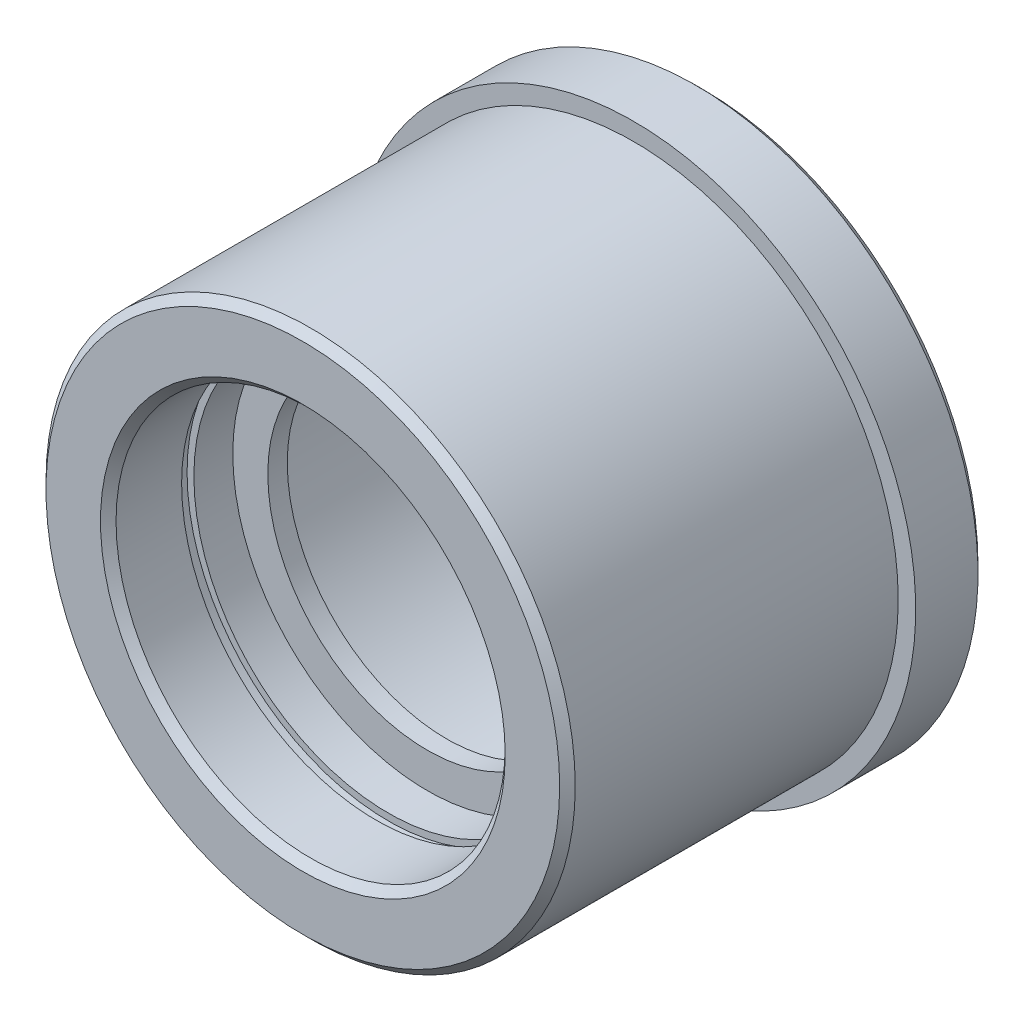
ISO-10303-21;
HEADER;
FILE_DESCRIPTION(('STEP AP214'),'2;1');
FILE_NAME('part.step','',(''),(''),'','','');
FILE_SCHEMA(('AUTOMOTIVE_DESIGN { 1 0 10303 214 1 1 1 1 }'));
ENDSEC;
DATA;
#1=APPLICATION_CONTEXT('core data for automotive mechanical design processes');
#2=APPLICATION_PROTOCOL_DEFINITION('international standard','automotive_design',2000,#1);
#3=PRODUCT_CONTEXT('',#1,'mechanical');
#4=PRODUCT('Part','Part','',(#3));
#5=PRODUCT_RELATED_PRODUCT_CATEGORY('part','',(#4));
#6=PRODUCT_DEFINITION_FORMATION('','',#4);
#7=PRODUCT_DEFINITION_CONTEXT('part definition',#1,'design');
#8=PRODUCT_DEFINITION('design','',#6,#7);
#9=PRODUCT_DEFINITION_SHAPE('','',#8);
#10=(LENGTH_UNIT() NAMED_UNIT(*) SI_UNIT(.MILLI.,.METRE.));
#11=(NAMED_UNIT(*) PLANE_ANGLE_UNIT() SI_UNIT($,.RADIAN.));
#12=(NAMED_UNIT(*) SI_UNIT($,.STERADIAN.) SOLID_ANGLE_UNIT());
#13=UNCERTAINTY_MEASURE_WITH_UNIT(LENGTH_MEASURE(1.E-05),#10,'distance_accuracy_value','');
#14=(GEOMETRIC_REPRESENTATION_CONTEXT(3) GLOBAL_UNCERTAINTY_ASSIGNED_CONTEXT((#13)) GLOBAL_UNIT_ASSIGNED_CONTEXT((#10,
#11,#12)) REPRESENTATION_CONTEXT('',''));
#15=CARTESIAN_POINT('',(0.,0.,0.));
#16=DIRECTION('',(0.,0.,1.));
#17=DIRECTION('',(1.,0.,0.));
#18=AXIS2_PLACEMENT_3D('',#15,#16,#17);
#19=CARTESIAN_POINT('',(0.,50.,103.));
#20=DIRECTION('',(0.,0.,1.));
#21=DIRECTION('',(1.,0.,0.));
#22=AXIS2_PLACEMENT_3D('',#19,#20,#21);
#23=PLANE('',#22);
#24=CARTESIAN_POINT('',(0.,0.,103.));
#25=DIRECTION('',(0.,0.,1.));
#26=DIRECTION('',(1.,0.,0.));
#27=AXIS2_PLACEMENT_3D('',#24,#25,#26);
#28=CIRCLE('',#27,66.);
#29=CARTESIAN_POINT('',(66.,0.,103.));
#30=VERTEX_POINT('',#29);
#31=EDGE_CURVE('E67',#30,#30,#28,.T.);
#32=ORIENTED_EDGE('',*,*,#31,.T.);
#33=EDGE_LOOP('',(#32));
#34=FACE_BOUND('',#33,.T.);
#35=CARTESIAN_POINT('',(0.,0.,103.));
#36=DIRECTION('',(0.,0.,1.));
#37=DIRECTION('',(1.,0.,0.));
#38=AXIS2_PLACEMENT_3D('',#35,#36,#37);
#39=CIRCLE('',#38,52.);
#40=CARTESIAN_POINT('',(52.,0.,103.));
#41=VERTEX_POINT('',#40);
#42=EDGE_CURVE('E70',#41,#41,#39,.F.);
#43=ORIENTED_EDGE('',*,*,#42,.T.);
#44=EDGE_LOOP('',(#43));
#45=FACE_BOUND('',#44,.T.);
#46=ADVANCED_FACE('F43',(#34,#45),#23,.T.);
#47=CARTESIAN_POINT('',(0.,0.,0.));
#48=DIRECTION('',(0.,0.,-1.));
#49=DIRECTION('',(-1.,0.,0.));
#50=AXIS2_PLACEMENT_3D('',#47,#48,#49);
#51=CYLINDRICAL_SURFACE('',#50,68.);
#52=CARTESIAN_POINT('',(0.,0.,101.));
#53=DIRECTION('',(0.,0.,1.));
#54=DIRECTION('',(1.,0.,0.));
#55=AXIS2_PLACEMENT_3D('',#52,#53,#54);
#56=CIRCLE('',#55,68.);
#57=CARTESIAN_POINT('',(68.,0.,101.));
#58=VERTEX_POINT('',#57);
#59=EDGE_CURVE('E73',#58,#58,#56,.F.);
#60=ORIENTED_EDGE('',*,*,#59,.T.);
#61=EDGE_LOOP('',(#60));
#62=FACE_BOUND('',#61,.T.);
#63=CARTESIAN_POINT('',(0.,0.,18.));
#64=DIRECTION('',(0.,0.,-1.));
#65=DIRECTION('',(-1.,0.,0.));
#66=AXIS2_PLACEMENT_3D('',#63,#64,#65);
#67=CIRCLE('',#66,68.);
#68=CARTESIAN_POINT('',(-68.,0.,18.));
#69=VERTEX_POINT('',#68);
#70=EDGE_CURVE('E76',#69,#69,#67,.T.);
#71=ORIENTED_EDGE('',*,*,#70,.F.);
#72=EDGE_LOOP('',(#71));
#73=FACE_BOUND('',#72,.T.);
#74=ADVANCED_FACE('F143',(#62,#73),#51,.T.);
#75=CARTESIAN_POINT('',(0.,72.5,18.));
#76=DIRECTION('',(0.,0.,1.));
#77=DIRECTION('',(1.,0.,0.));
#78=AXIS2_PLACEMENT_3D('',#75,#76,#77);
#79=PLANE('',#78);
#80=ORIENTED_EDGE('',*,*,#70,.T.);
#81=EDGE_LOOP('',(#80));
#82=FACE_BOUND('',#81,.T.);
#83=CARTESIAN_POINT('',(0.,0.,18.));
#84=DIRECTION('',(0.,0.,-1.));
#85=DIRECTION('',(-1.,0.,0.));
#86=AXIS2_PLACEMENT_3D('',#83,#84,#85);
#87=CIRCLE('',#86,72.5);
#88=CARTESIAN_POINT('',(-72.5,0.,18.));
#89=VERTEX_POINT('',#88);
#90=EDGE_CURVE('E79',#89,#89,#87,.T.);
#91=ORIENTED_EDGE('',*,*,#90,.F.);
#92=EDGE_LOOP('',(#91));
#93=FACE_BOUND('',#92,.T.);
#94=ADVANCED_FACE('F149',(#82,#93),#79,.T.);
#95=CARTESIAN_POINT('',(0.,0.,0.));
#96=DIRECTION('',(0.,0.,-1.));
#97=DIRECTION('',(-1.,0.,0.));
#98=AXIS2_PLACEMENT_3D('',#95,#96,#97);
#99=CYLINDRICAL_SURFACE('',#98,72.5);
#100=CARTESIAN_POINT('',(0.,0.,2.00000000000001));
#101=DIRECTION('',(0.,0.,-1.));
#102=DIRECTION('',(-1.,0.,0.));
#103=AXIS2_PLACEMENT_3D('',#100,#101,#102);
#104=CIRCLE('',#103,72.5);
#105=CARTESIAN_POINT('',(-72.5,0.,2.00000000000001));
#106=VERTEX_POINT('',#105);
#107=EDGE_CURVE('E51',#106,#106,#104,.F.);
#108=ORIENTED_EDGE('',*,*,#107,.T.);
#109=EDGE_LOOP('',(#108));
#110=FACE_BOUND('',#109,.T.);
#111=ORIENTED_EDGE('',*,*,#90,.T.);
#112=EDGE_LOOP('',(#111));
#113=FACE_BOUND('',#112,.T.);
#114=ADVANCED_FACE('F184',(#110,#113),#99,.T.);
#115=CARTESIAN_POINT('',(0.,72.5,0.));
#116=DIRECTION('',(0.,0.,-1.));
#117=DIRECTION('',(-1.,0.,0.));
#118=AXIS2_PLACEMENT_3D('',#115,#116,#117);
#119=PLANE('',#118);
#120=CARTESIAN_POINT('',(0.,0.,0.));
#121=DIRECTION('',(0.,0.,-1.));
#122=DIRECTION('',(-1.,0.,0.));
#123=AXIS2_PLACEMENT_3D('',#120,#121,#122);
#124=CIRCLE('',#123,70.5);
#125=CARTESIAN_POINT('',(-70.5,0.,0.));
#126=VERTEX_POINT('',#125);
#127=EDGE_CURVE('E55',#126,#126,#124,.T.);
#128=ORIENTED_EDGE('',*,*,#127,.T.);
#129=EDGE_LOOP('',(#128));
#130=FACE_BOUND('',#129,.T.);
#131=CARTESIAN_POINT('',(0.,0.,0.));
#132=DIRECTION('',(0.,0.,-1.));
#133=DIRECTION('',(-1.,0.,0.));
#134=AXIS2_PLACEMENT_3D('',#131,#132,#133);
#135=CIRCLE('',#134,62.);
#136=CARTESIAN_POINT('',(-62.,0.,0.));
#137=VERTEX_POINT('',#136);
#138=EDGE_CURVE('E59',#137,#137,#135,.F.);
#139=ORIENTED_EDGE('',*,*,#138,.T.);
#140=EDGE_LOOP('',(#139));
#141=FACE_BOUND('',#140,.T.);
#142=ADVANCED_FACE('F180',(#130,#141),#119,.T.);
#143=CARTESIAN_POINT('',(0.,0.,0.));
#144=DIRECTION('',(0.,0.,-1.));
#145=DIRECTION('',(-1.,0.,0.));
#146=AXIS2_PLACEMENT_3D('',#143,#144,#145);
#147=CYLINDRICAL_SURFACE('',#146,60.);
#148=CARTESIAN_POINT('',(0.,0.,2.00000000000001));
#149=DIRECTION('',(0.,0.,-1.));
#150=DIRECTION('',(-1.,0.,0.));
#151=AXIS2_PLACEMENT_3D('',#148,#149,#150);
#152=CIRCLE('',#151,60.);
#153=CARTESIAN_POINT('',(-60.,0.,2.00000000000001));
#154=VERTEX_POINT('',#153);
#155=EDGE_CURVE('E10',#154,#154,#152,.T.);
#156=ORIENTED_EDGE('',*,*,#155,.T.);
#157=EDGE_LOOP('',(#156));
#158=FACE_BOUND('',#157,.T.);
#159=CARTESIAN_POINT('',(0.,0.,9.84999999999999));
#160=DIRECTION('',(0.,0.,-1.));
#161=DIRECTION('',(-1.,0.,0.));
#162=AXIS2_PLACEMENT_3D('',#159,#160,#161);
#163=CIRCLE('',#162,60.);
#164=CARTESIAN_POINT('',(-60.,0.,9.84999999999999));
#165=VERTEX_POINT('',#164);
#166=EDGE_CURVE('E82',#165,#165,#163,.T.);
#167=ORIENTED_EDGE('',*,*,#166,.F.);
#168=EDGE_LOOP('',(#167));
#169=FACE_BOUND('',#168,.T.);
#170=ADVANCED_FACE('F183',(#158,#169),#147,.F.);
#171=CARTESIAN_POINT('',(0.,62.,9.84999999999999));
#172=DIRECTION('',(0.,0.,1.));
#173=DIRECTION('',(1.,0.,0.));
#174=AXIS2_PLACEMENT_3D('',#171,#172,#173);
#175=PLANE('',#174);
#176=ORIENTED_EDGE('',*,*,#166,.T.);
#177=EDGE_LOOP('',(#176));
#178=FACE_BOUND('',#177,.T.);
#179=CARTESIAN_POINT('',(0.,0.,9.84999999999998));
#180=DIRECTION('',(0.,0.,-1.));
#181=DIRECTION('',(-1.,0.,0.));
#182=AXIS2_PLACEMENT_3D('',#179,#180,#181);
#183=CIRCLE('',#182,62.);
#184=CARTESIAN_POINT('',(-62.,0.,9.84999999999998));
#185=VERTEX_POINT('',#184);
#186=EDGE_CURVE('E85',#185,#185,#183,.T.);
#187=ORIENTED_EDGE('',*,*,#186,.F.);
#188=EDGE_LOOP('',(#187));
#189=FACE_BOUND('',#188,.T.);
#190=ADVANCED_FACE('F192',(#178,#189),#175,.T.);
#191=CARTESIAN_POINT('',(0.,0.,0.));
#192=DIRECTION('',(0.,0.,-1.));
#193=DIRECTION('',(-1.,0.,0.));
#194=AXIS2_PLACEMENT_3D('',#191,#192,#193);
#195=CYLINDRICAL_SURFACE('',#194,62.);
#196=ORIENTED_EDGE('',*,*,#186,.T.);
#197=EDGE_LOOP('',(#196));
#198=FACE_BOUND('',#197,.T.);
#199=CARTESIAN_POINT('',(0.,0.,14.));
#200=DIRECTION('',(0.,0.,-1.));
#201=DIRECTION('',(-1.,0.,0.));
#202=AXIS2_PLACEMENT_3D('',#199,#200,#201);
#203=CIRCLE('',#202,62.);
#204=CARTESIAN_POINT('',(-62.,0.,14.));
#205=VERTEX_POINT('',#204);
#206=EDGE_CURVE('E88',#205,#205,#203,.T.);
#207=ORIENTED_EDGE('',*,*,#206,.F.);
#208=EDGE_LOOP('',(#207));
#209=FACE_BOUND('',#208,.T.);
#210=ADVANCED_FACE('F214',(#198,#209),#195,.F.);
#211=CARTESIAN_POINT('',(0.,60.,14.));
#212=DIRECTION('',(0.,0.,-1.));
#213=DIRECTION('',(-1.,0.,0.));
#214=AXIS2_PLACEMENT_3D('',#211,#212,#213);
#215=PLANE('',#214);
#216=ORIENTED_EDGE('',*,*,#206,.T.);
#217=EDGE_LOOP('',(#216));
#218=FACE_BOUND('',#217,.T.);
#219=CARTESIAN_POINT('',(0.,0.,14.));
#220=DIRECTION('',(0.,0.,-1.));
#221=DIRECTION('',(-1.,0.,0.));
#222=AXIS2_PLACEMENT_3D('',#219,#220,#221);
#223=CIRCLE('',#222,60.);
#224=CARTESIAN_POINT('',(-60.,0.,14.));
#225=VERTEX_POINT('',#224);
#226=EDGE_CURVE('E91',#225,#225,#223,.T.);
#227=ORIENTED_EDGE('',*,*,#226,.F.);
#228=EDGE_LOOP('',(#227));
#229=FACE_BOUND('',#228,.T.);
#230=ADVANCED_FACE('F223',(#218,#229),#215,.T.);
#231=CARTESIAN_POINT('',(0.,0.,0.));
#232=DIRECTION('',(0.,0.,-1.));
#233=DIRECTION('',(-1.,0.,0.));
#234=AXIS2_PLACEMENT_3D('',#231,#232,#233);
#235=CYLINDRICAL_SURFACE('',#234,60.);
#236=ORIENTED_EDGE('',*,*,#226,.T.);
#237=EDGE_LOOP('',(#236));
#238=FACE_BOUND('',#237,.T.);
#239=CARTESIAN_POINT('',(0.,0.,63.));
#240=DIRECTION('',(0.,0.,-1.));
#241=DIRECTION('',(-1.,0.,0.));
#242=AXIS2_PLACEMENT_3D('',#239,#240,#241);
#243=CIRCLE('',#242,60.);
#244=CARTESIAN_POINT('',(-60.,0.,63.));
#245=VERTEX_POINT('',#244);
#246=EDGE_CURVE('E94',#245,#245,#243,.T.);
#247=ORIENTED_EDGE('',*,*,#246,.F.);
#248=EDGE_LOOP('',(#247));
#249=FACE_BOUND('',#248,.T.);
#250=ADVANCED_FACE('F232',(#238,#249),#235,.F.);
#251=CARTESIAN_POINT('',(0.,50.,63.));
#252=DIRECTION('',(0.,0.,-1.));
#253=DIRECTION('',(-1.,0.,0.));
#254=AXIS2_PLACEMENT_3D('',#251,#252,#253);
#255=PLANE('',#254);
#256=ORIENTED_EDGE('',*,*,#246,.T.);
#257=EDGE_LOOP('',(#256));
#258=FACE_BOUND('',#257,.T.);
#259=CARTESIAN_POINT('',(0.,0.,63.));
#260=DIRECTION('',(0.,0.,-1.));
#261=DIRECTION('',(-1.,0.,0.));
#262=AXIS2_PLACEMENT_3D('',#259,#260,#261);
#263=CIRCLE('',#262,50.);
#264=CARTESIAN_POINT('',(-50.,0.,63.));
#265=VERTEX_POINT('',#264);
#266=EDGE_CURVE('E97',#265,#265,#263,.T.);
#267=ORIENTED_EDGE('',*,*,#266,.F.);
#268=EDGE_LOOP('',(#267));
#269=FACE_BOUND('',#268,.T.);
#270=ADVANCED_FACE('F241',(#258,#269),#255,.T.);
#271=CARTESIAN_POINT('',(0.,0.,0.));
#272=DIRECTION('',(0.,0.,-1.));
#273=DIRECTION('',(-1.,0.,0.));
#274=AXIS2_PLACEMENT_3D('',#271,#272,#273);
#275=CYLINDRICAL_SURFACE('',#274,50.);
#276=ORIENTED_EDGE('',*,*,#266,.T.);
#277=EDGE_LOOP('',(#276));
#278=FACE_BOUND('',#277,.T.);
#279=CARTESIAN_POINT('',(0.,0.,66.));
#280=DIRECTION('',(0.,0.,-1.));
#281=DIRECTION('',(-1.,0.,0.));
#282=AXIS2_PLACEMENT_3D('',#279,#280,#281);
#283=CIRCLE('',#282,50.);
#284=CARTESIAN_POINT('',(-50.,0.,66.));
#285=VERTEX_POINT('',#284);
#286=EDGE_CURVE('E100',#285,#285,#283,.T.);
#287=ORIENTED_EDGE('',*,*,#286,.F.);
#288=EDGE_LOOP('',(#287));
#289=FACE_BOUND('',#288,.T.);
#290=ADVANCED_FACE('F250',(#278,#289),#275,.F.);
#291=CARTESIAN_POINT('',(0.,41.,66.));
#292=DIRECTION('',(0.,0.,-1.));
#293=DIRECTION('',(-1.,0.,0.));
#294=AXIS2_PLACEMENT_3D('',#291,#292,#293);
#295=PLANE('',#294);
#296=ORIENTED_EDGE('',*,*,#286,.T.);
#297=EDGE_LOOP('',(#296));
#298=FACE_BOUND('',#297,.T.);
#299=CARTESIAN_POINT('',(0.,0.,66.));
#300=DIRECTION('',(0.,0.,-1.));
#301=DIRECTION('',(-1.,0.,0.));
#302=AXIS2_PLACEMENT_3D('',#299,#300,#301);
#303=CIRCLE('',#302,41.);
#304=CARTESIAN_POINT('',(-41.,0.,66.));
#305=VERTEX_POINT('',#304);
#306=EDGE_CURVE('E103',#305,#305,#303,.T.);
#307=ORIENTED_EDGE('',*,*,#306,.F.);
#308=EDGE_LOOP('',(#307));
#309=FACE_BOUND('',#308,.T.);
#310=ADVANCED_FACE('F259',(#298,#309),#295,.T.);
#311=CARTESIAN_POINT('',(0.,0.,0.));
#312=DIRECTION('',(0.,0.,-1.));
#313=DIRECTION('',(-1.,0.,0.));
#314=AXIS2_PLACEMENT_3D('',#311,#312,#313);
#315=CYLINDRICAL_SURFACE('',#314,41.);
#316=ORIENTED_EDGE('',*,*,#306,.T.);
#317=EDGE_LOOP('',(#316));
#318=FACE_BOUND('',#317,.T.);
#319=CARTESIAN_POINT('',(0.,0.,71.));
#320=DIRECTION('',(0.,0.,-1.));
#321=DIRECTION('',(-1.,0.,0.));
#322=AXIS2_PLACEMENT_3D('',#319,#320,#321);
#323=CIRCLE('',#322,41.);
#324=CARTESIAN_POINT('',(-41.,0.,71.));
#325=VERTEX_POINT('',#324);
#326=EDGE_CURVE('E106',#325,#325,#323,.T.);
#327=ORIENTED_EDGE('',*,*,#326,.F.);
#328=EDGE_LOOP('',(#327));
#329=FACE_BOUND('',#328,.T.);
#330=ADVANCED_FACE('F268',(#318,#329),#315,.F.);
#331=CARTESIAN_POINT('',(0.,41.,71.));
#332=DIRECTION('',(0.,0.,1.));
#333=DIRECTION('',(1.,0.,0.));
#334=AXIS2_PLACEMENT_3D('',#331,#332,#333);
#335=PLANE('',#334);
#336=ORIENTED_EDGE('',*,*,#326,.T.);
#337=EDGE_LOOP('',(#336));
#338=FACE_BOUND('',#337,.T.);
#339=CARTESIAN_POINT('',(0.,0.,71.));
#340=DIRECTION('',(0.,0.,-1.));
#341=DIRECTION('',(-1.,0.,0.));
#342=AXIS2_PLACEMENT_3D('',#339,#340,#341);
#343=CIRCLE('',#342,50.);
#344=CARTESIAN_POINT('',(-50.,0.,71.));
#345=VERTEX_POINT('',#344);
#346=EDGE_CURVE('E109',#345,#345,#343,.T.);
#347=ORIENTED_EDGE('',*,*,#346,.F.);
#348=EDGE_LOOP('',(#347));
#349=FACE_BOUND('',#348,.T.);
#350=ADVANCED_FACE('F277',(#338,#349),#335,.T.);
#351=CARTESIAN_POINT('',(0.,0.,0.));
#352=DIRECTION('',(0.,0.,-1.));
#353=DIRECTION('',(-1.,0.,0.));
#354=AXIS2_PLACEMENT_3D('',#351,#352,#353);
#355=CYLINDRICAL_SURFACE('',#354,50.);
#356=ORIENTED_EDGE('',*,*,#346,.T.);
#357=EDGE_LOOP('',(#356));
#358=FACE_BOUND('',#357,.T.);
#359=CARTESIAN_POINT('',(0.,0.,81.));
#360=DIRECTION('',(0.,0.,-1.));
#361=DIRECTION('',(-1.,0.,0.));
#362=AXIS2_PLACEMENT_3D('',#359,#360,#361);
#363=CIRCLE('',#362,50.);
#364=CARTESIAN_POINT('',(-50.,0.,81.));
#365=VERTEX_POINT('',#364);
#366=EDGE_CURVE('E112',#365,#365,#363,.T.);
#367=ORIENTED_EDGE('',*,*,#366,.F.);
#368=EDGE_LOOP('',(#367));
#369=FACE_BOUND('',#368,.T.);
#370=ADVANCED_FACE('F286',(#358,#369),#355,.F.);
#371=CARTESIAN_POINT('',(0.,51.75,81.));
#372=DIRECTION('',(0.,0.,1.));
#373=DIRECTION('',(1.,0.,0.));
#374=AXIS2_PLACEMENT_3D('',#371,#372,#373);
#375=PLANE('',#374);
#376=ORIENTED_EDGE('',*,*,#366,.T.);
#377=EDGE_LOOP('',(#376));
#378=FACE_BOUND('',#377,.T.);
#379=CARTESIAN_POINT('',(0.,0.,81.));
#380=DIRECTION('',(0.,0.,-1.));
#381=DIRECTION('',(-1.,0.,0.));
#382=AXIS2_PLACEMENT_3D('',#379,#380,#381);
#383=CIRCLE('',#382,51.75);
#384=CARTESIAN_POINT('',(-51.75,0.,81.));
#385=VERTEX_POINT('',#384);
#386=EDGE_CURVE('E115',#385,#385,#383,.T.);
#387=ORIENTED_EDGE('',*,*,#386,.F.);
#388=EDGE_LOOP('',(#387));
#389=FACE_BOUND('',#388,.T.);
#390=ADVANCED_FACE('F140',(#378,#389),#375,.T.);
#391=CARTESIAN_POINT('',(0.,0.,0.));
#392=DIRECTION('',(0.,0.,-1.));
#393=DIRECTION('',(-1.,0.,0.));
#394=AXIS2_PLACEMENT_3D('',#391,#392,#393);
#395=CYLINDRICAL_SURFACE('',#394,51.75);
#396=ORIENTED_EDGE('',*,*,#386,.T.);
#397=EDGE_LOOP('',(#396));
#398=FACE_BOUND('',#397,.T.);
#399=CARTESIAN_POINT('',(0.,0.,84.15));
#400=DIRECTION('',(0.,0.,-1.));
#401=DIRECTION('',(-1.,0.,0.));
#402=AXIS2_PLACEMENT_3D('',#399,#400,#401);
#403=CIRCLE('',#402,51.75);
#404=CARTESIAN_POINT('',(-51.75,0.,84.15));
#405=VERTEX_POINT('',#404);
#406=EDGE_CURVE('E118',#405,#405,#403,.T.);
#407=ORIENTED_EDGE('',*,*,#406,.F.);
#408=EDGE_LOOP('',(#407));
#409=FACE_BOUND('',#408,.T.);
#410=ADVANCED_FACE('F129',(#398,#409),#395,.F.);
#411=CARTESIAN_POINT('',(0.,50.,84.15));
#412=DIRECTION('',(0.,0.,-1.));
#413=DIRECTION('',(-1.,0.,0.));
#414=AXIS2_PLACEMENT_3D('',#411,#412,#413);
#415=PLANE('',#414);
#416=ORIENTED_EDGE('',*,*,#406,.T.);
#417=EDGE_LOOP('',(#416));
#418=FACE_BOUND('',#417,.T.);
#419=CARTESIAN_POINT('',(0.,0.,84.15));
#420=DIRECTION('',(0.,0.,-1.));
#421=DIRECTION('',(-1.,0.,0.));
#422=AXIS2_PLACEMENT_3D('',#419,#420,#421);
#423=CIRCLE('',#422,50.);
#424=CARTESIAN_POINT('',(-50.,0.,84.15));
#425=VERTEX_POINT('',#424);
#426=EDGE_CURVE('E121',#425,#425,#423,.T.);
#427=ORIENTED_EDGE('',*,*,#426,.F.);
#428=EDGE_LOOP('',(#427));
#429=FACE_BOUND('',#428,.T.);
#430=ADVANCED_FACE('F127',(#418,#429),#415,.T.);
#431=CARTESIAN_POINT('',(0.,0.,0.));
#432=DIRECTION('',(0.,0.,-1.));
#433=DIRECTION('',(-1.,0.,0.));
#434=AXIS2_PLACEMENT_3D('',#431,#432,#433);
#435=CYLINDRICAL_SURFACE('',#434,50.);
#436=CARTESIAN_POINT('',(0.,0.,101.));
#437=DIRECTION('',(0.,0.,1.));
#438=DIRECTION('',(1.,0.,0.));
#439=AXIS2_PLACEMENT_3D('',#436,#437,#438);
#440=CIRCLE('',#439,50.);
#441=CARTESIAN_POINT('',(50.,0.,101.));
#442=VERTEX_POINT('',#441);
#443=EDGE_CURVE('E64',#442,#442,#440,.T.);
#444=ORIENTED_EDGE('',*,*,#443,.T.);
#445=EDGE_LOOP('',(#444));
#446=FACE_BOUND('',#445,.T.);
#447=ORIENTED_EDGE('',*,*,#426,.T.);
#448=EDGE_LOOP('',(#447));
#449=FACE_BOUND('',#448,.T.);
#450=ADVANCED_FACE('F125',(#446,#449),#435,.F.);
#451=CARTESIAN_POINT('',(0.,0.,101.));
#452=DIRECTION('',(0.,0.,-1.));
#453=DIRECTION('',(-1.,0.,0.));
#454=AXIS2_PLACEMENT_3D('',#451,#452,#453);
#455=CONICAL_SURFACE('',#454,68.,0.785398163397455);
#456=ORIENTED_EDGE('',*,*,#31,.F.);
#457=EDGE_LOOP('',(#456));
#458=FACE_BOUND('',#457,.T.);
#459=ORIENTED_EDGE('',*,*,#59,.F.);
#460=EDGE_LOOP('',(#459));
#461=FACE_BOUND('',#460,.T.);
#462=ADVANCED_FACE('F137',(#458,#461),#455,.T.);
#463=CARTESIAN_POINT('',(0.,0.,103.));
#464=DIRECTION('',(0.,0.,1.));
#465=DIRECTION('',(1.,0.,0.));
#466=AXIS2_PLACEMENT_3D('',#463,#464,#465);
#467=CONICAL_SURFACE('',#466,52.,0.78539816339745);
#468=ORIENTED_EDGE('',*,*,#443,.F.);
#469=EDGE_LOOP('',(#468));
#470=FACE_BOUND('',#469,.T.);
#471=ORIENTED_EDGE('',*,*,#42,.F.);
#472=EDGE_LOOP('',(#471));
#473=FACE_BOUND('',#472,.T.);
#474=ADVANCED_FACE('F161',(#470,#473),#467,.F.);
#475=CARTESIAN_POINT('',(0.,0.,0.));
#476=DIRECTION('',(0.,0.,1.));
#477=DIRECTION('',(1.,0.,0.));
#478=AXIS2_PLACEMENT_3D('',#475,#476,#477);
#479=CONICAL_SURFACE('',#478,70.5,0.785398163397441);
#480=ORIENTED_EDGE('',*,*,#107,.F.);
#481=EDGE_LOOP('',(#480));
#482=FACE_BOUND('',#481,.T.);
#483=ORIENTED_EDGE('',*,*,#127,.F.);
#484=EDGE_LOOP('',(#483));
#485=FACE_BOUND('',#484,.T.);
#486=ADVANCED_FACE('F167',(#482,#485),#479,.T.);
#487=CARTESIAN_POINT('',(0.,0.,2.00000000000001));
#488=DIRECTION('',(0.,0.,-1.));
#489=DIRECTION('',(-1.,0.,0.));
#490=AXIS2_PLACEMENT_3D('',#487,#488,#489);
#491=CONICAL_SURFACE('',#490,60.,0.785398163397454);
#492=ORIENTED_EDGE('',*,*,#138,.F.);
#493=EDGE_LOOP('',(#492));
#494=FACE_BOUND('',#493,.T.);
#495=ORIENTED_EDGE('',*,*,#155,.F.);
#496=EDGE_LOOP('',(#495));
#497=FACE_BOUND('',#496,.T.);
#498=ADVANCED_FACE('F46',(#494,#497),#491,.F.);
#499=CLOSED_SHELL('',(#46,#74,#94,#114,#142,#170,#190,#210,#230,#250,#270,#290,#310,#330,#350,
#370,#390,#410,#430,#450,#462,#474,#486,#498));
#500=MANIFOLD_SOLID_BREP('B2',#499);
#501=ADVANCED_BREP_SHAPE_REPRESENTATION('',(#18,#500),#14);
#502=SHAPE_DEFINITION_REPRESENTATION(#9,#501);
ENDSEC;
END-ISO-10303-21;
